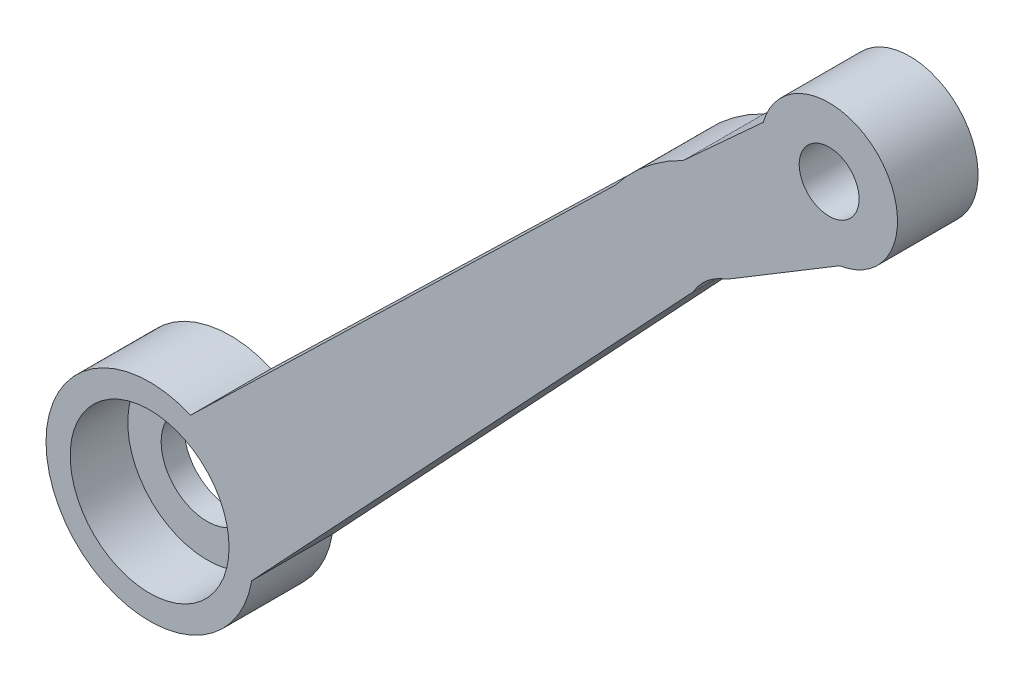
ISO-10303-21;
HEADER;
FILE_DESCRIPTION(('STEP AP214'),'2;1');
FILE_NAME('part.step','',(''),(''),'','','');
FILE_SCHEMA(('AUTOMOTIVE_DESIGN { 1 0 10303 214 1 1 1 1 }'));
ENDSEC;
DATA;
#1=APPLICATION_CONTEXT('core data for automotive mechanical design processes');
#2=APPLICATION_PROTOCOL_DEFINITION('international standard','automotive_design',2000,#1);
#3=PRODUCT_CONTEXT('',#1,'mechanical');
#4=PRODUCT('Part','Part','',(#3));
#5=PRODUCT_RELATED_PRODUCT_CATEGORY('part','',(#4));
#6=PRODUCT_DEFINITION_FORMATION('','',#4);
#7=PRODUCT_DEFINITION_CONTEXT('part definition',#1,'design');
#8=PRODUCT_DEFINITION('design','',#6,#7);
#9=PRODUCT_DEFINITION_SHAPE('','',#8);
#10=(LENGTH_UNIT() NAMED_UNIT(*) SI_UNIT(.MILLI.,.METRE.));
#11=(NAMED_UNIT(*) PLANE_ANGLE_UNIT() SI_UNIT($,.RADIAN.));
#12=(NAMED_UNIT(*) SI_UNIT($,.STERADIAN.) SOLID_ANGLE_UNIT());
#13=UNCERTAINTY_MEASURE_WITH_UNIT(LENGTH_MEASURE(1.E-05),#10,'distance_accuracy_value','');
#14=(GEOMETRIC_REPRESENTATION_CONTEXT(3) GLOBAL_UNCERTAINTY_ASSIGNED_CONTEXT((#13)) GLOBAL_UNIT_ASSIGNED_CONTEXT((#10,
#11,#12)) REPRESENTATION_CONTEXT('',''));
#15=CARTESIAN_POINT('',(0.,0.,0.));
#16=DIRECTION('',(0.,0.,1.));
#17=DIRECTION('',(1.,0.,0.));
#18=AXIS2_PLACEMENT_3D('',#15,#16,#17);
#19=CARTESIAN_POINT('',(-138.994793103417,-84.3283323026696,6.79269035065006));
#20=DIRECTION('',(0.,0.,1.));
#21=DIRECTION('',(1.,0.,0.));
#22=AXIS2_PLACEMENT_3D('',#19,#20,#21);
#23=PLANE('',#22);
#24=CARTESIAN_POINT('',(-50.4680392104002,-3.9750038774592,6.79269035065006));
#25=DIRECTION('',(0.,0.,1.));
#26=DIRECTION('',(1.,0.,0.));
#27=AXIS2_PLACEMENT_3D('',#24,#25,#26);
#28=CIRCLE('',#27,3.90000000000001);
#29=CARTESIAN_POINT('',(-46.5680392104001,-3.9750038774592,6.79269035065006));
#30=VERTEX_POINT('',#29);
#31=EDGE_CURVE('E165',#30,#30,#28,.T.);
#32=ORIENTED_EDGE('',*,*,#31,.F.);
#33=EDGE_LOOP('',(#32));
#34=FACE_BOUND('',#33,.T.);
#35=CARTESIAN_POINT('',(-138.994793103417,-84.3283323026696,6.79269035065006));
#36=DIRECTION('',(0.,0.,1.));
#37=DIRECTION('',(1.,0.,0.));
#38=AXIS2_PLACEMENT_3D('',#35,#36,#37);
#39=CIRCLE('',#38,13.5);
#40=CARTESIAN_POINT('',(-133.660112583292,-71.9270749572146,6.79269035065006));
#41=VERTEX_POINT('',#40);
#42=CARTESIAN_POINT('',(-125.688932711568,-86.609577408445,6.79269035065006));
#43=VERTEX_POINT('',#42);
#44=EDGE_CURVE('E112',#41,#43,#39,.T.);
#45=ORIENTED_EDGE('',*,*,#44,.T.);
#46=DIRECTION('',(0.683917048390765,0.729559778853291,0.));
#47=VECTOR('',#46,1.);
#48=CARTESIAN_POINT('',(-125.688932711568,-86.609577408445,6.79269035065006));
#49=LINE('',#48,#47);
#50=CARTESIAN_POINT('',(-68.1848369339732,-25.2678174722458,6.79269035065006));
#51=VERTEX_POINT('',#50);
#52=EDGE_CURVE('E174',#43,#51,#49,.T.);
#53=ORIENTED_EDGE('',*,*,#52,.T.);
#54=CARTESIAN_POINT('',(-61.1608541579813,-29.3018806798018,6.79269035065006));
#55=DIRECTION('',(0.,0.,-1.));
#56=DIRECTION('',(1.,0.,0.));
#57=AXIS2_PLACEMENT_3D('',#54,#55,#56);
#58=CIRCLE('',#57,8.09999999999925);
#59=CARTESIAN_POINT('',(-63.764516707869,-21.6317476088375,6.79269035065006));
#60=VERTEX_POINT('',#59);
#61=EDGE_CURVE('E177',#51,#60,#58,.T.);
#62=ORIENTED_EDGE('',*,*,#61,.T.);
#63=DIRECTION('',(0.856088074759195,0.51682996067865,0.));
#64=VECTOR('',#63,1.);
#65=CARTESIAN_POINT('',(-63.764516707869,-21.6317476088375,6.79269035065006));
#66=LINE('',#65,#64);
#67=CARTESIAN_POINT('',(-49.1016473183913,-12.7796091041263,6.79269035065006));
#68=VERTEX_POINT('',#67);
#69=EDGE_CURVE('E180',#60,#68,#66,.T.);
#70=ORIENTED_EDGE('',*,*,#69,.T.);
#71=CARTESIAN_POINT('',(-50.4680392104002,-3.9750038774592,6.79269035065006));
#72=DIRECTION('',(0.,0.,1.));
#73=DIRECTION('',(1.,0.,0.));
#74=AXIS2_PLACEMENT_3D('',#71,#72,#73);
#75=CIRCLE('',#74,8.91000000000005);
#76=CARTESIAN_POINT('',(-59.044990429255,-1.56170576297265,6.79269035065006));
#77=VERTEX_POINT('',#76);
#78=EDGE_CURVE('E183',#68,#77,#75,.T.);
#79=ORIENTED_EDGE('',*,*,#78,.T.);
#80=DIRECTION('',(-0.738432343533464,-0.674327571751057,0.));
#81=VECTOR('',#80,1.);
#82=CARTESIAN_POINT('',(-59.044990429255,-1.56170576297265,6.79269035065006));
#83=LINE('',#82,#81);
#84=CARTESIAN_POINT('',(-69.4681557092937,-11.0800154562017,6.79269035065006));
#85=VERTEX_POINT('',#84);
#86=EDGE_CURVE('E186',#77,#85,#83,.T.);
#87=ORIENTED_EDGE('',*,*,#86,.T.);
#88=CARTESIAN_POINT('',(-58.614319970954,-33.4328666807129,6.79269035065006));
#89=DIRECTION('',(0.,0.,1.));
#90=DIRECTION('',(1.,0.,0.));
#91=AXIS2_PLACEMENT_3D('',#88,#89,#90);
#92=CIRCLE('',#91,24.8486560622499);
#93=CARTESIAN_POINT('',(-78.3087961615021,-18.2808596955005,6.79269035065006));
#94=VERTEX_POINT('',#93);
#95=EDGE_CURVE('E63',#85,#94,#92,.T.);
#96=ORIENTED_EDGE('',*,*,#95,.T.);
#97=DIRECTION('',(-0.718080536459822,-0.695960015487653,0.));
#98=VECTOR('',#97,1.);
#99=CARTESIAN_POINT('',(-78.3087961615021,-18.2808596955005,6.79269035065006));
#100=LINE('',#99,#98);
#101=EDGE_CURVE('E58',#94,#41,#100,.T.);
#102=ORIENTED_EDGE('',*,*,#101,.T.);
#103=EDGE_LOOP('',(#45,#53,#62,#70,#79,#87,#96,#102));
#104=FACE_BOUND('',#103,.T.);
#105=CARTESIAN_POINT('',(-138.994793103417,-84.3283323026696,6.79269035065006));
#106=DIRECTION('',(0.,0.,1.));
#107=DIRECTION('',(1.,0.,0.));
#108=AXIS2_PLACEMENT_3D('',#105,#106,#107);
#109=CIRCLE('',#108,10.35);
#110=CARTESIAN_POINT('',(-128.644793103417,-84.3283323026696,6.79269035065006));
#111=VERTEX_POINT('',#110);
#112=EDGE_CURVE('E161',#111,#111,#109,.T.);
#113=ORIENTED_EDGE('',*,*,#112,.F.);
#114=EDGE_LOOP('',(#113));
#115=FACE_BOUND('',#114,.T.);
#116=ADVANCED_FACE('F42',(#34,#104,#115),#23,.T.);
#117=CARTESIAN_POINT('',(-138.994793103417,-84.3283323026696,6.79269035065006));
#118=DIRECTION('',(0.,0.,-1.));
#119=DIRECTION('',(-1.,0.,0.));
#120=AXIS2_PLACEMENT_3D('',#117,#118,#119);
#121=CYLINDRICAL_SURFACE('',#120,13.5);
#122=DIRECTION('',(0.,0.,-1.));
#123=VECTOR('',#122,1.);
#124=CARTESIAN_POINT('',(-133.660112583292,-71.9270749572146,6.79269035065006));
#125=LINE('',#124,#123);
#126=CARTESIAN_POINT('',(-133.660112583292,-71.9270749572146,-3.70730964934994));
#127=VERTEX_POINT('',#126);
#128=EDGE_CURVE('E107',#41,#127,#125,.T.);
#129=ORIENTED_EDGE('',*,*,#128,.T.);
#130=CARTESIAN_POINT('',(-138.994793103417,-84.3283323026696,-3.70730964934994));
#131=DIRECTION('',(0.,0.,-1.));
#132=DIRECTION('',(-1.,0.,0.));
#133=AXIS2_PLACEMENT_3D('',#130,#131,#132);
#134=CIRCLE('',#133,13.5);
#135=CARTESIAN_POINT('',(-125.688932711568,-86.609577408445,-3.70730964934994));
#136=VERTEX_POINT('',#135);
#137=EDGE_CURVE('E111',#136,#127,#134,.T.);
#138=ORIENTED_EDGE('',*,*,#137,.F.);
#139=DIRECTION('',(0.,0.,-1.));
#140=VECTOR('',#139,1.);
#141=CARTESIAN_POINT('',(-125.688932711568,-86.609577408445,6.79269035065006));
#142=LINE('',#141,#140);
#143=EDGE_CURVE('E11',#43,#136,#142,.T.);
#144=ORIENTED_EDGE('',*,*,#143,.F.);
#145=ORIENTED_EDGE('',*,*,#44,.F.);
#146=EDGE_LOOP('',(#129,#138,#144,#145));
#147=FACE_BOUND('',#146,.T.);
#148=ADVANCED_FACE('F44',(#147),#121,.T.);
#149=CARTESIAN_POINT('',(-125.688932711568,-86.609577408445,6.79269035065006));
#150=DIRECTION('',(-0.729559778853291,0.683917048390765,0.));
#151=DIRECTION('',(-0.683917048390765,-0.729559778853291,0.));
#152=AXIS2_PLACEMENT_3D('',#149,#150,#151);
#153=PLANE('',#152);
#154=ORIENTED_EDGE('',*,*,#143,.T.);
#155=DIRECTION('',(-0.683917048390765,-0.729559778853291,0.));
#156=VECTOR('',#155,1.);
#157=CARTESIAN_POINT('',(-68.1848369339732,-25.2678174722458,-3.70730964934994));
#158=LINE('',#157,#156);
#159=CARTESIAN_POINT('',(-68.1848369339732,-25.2678174722458,-3.70730964934994));
#160=VERTEX_POINT('',#159);
#161=EDGE_CURVE('E131',#160,#136,#158,.T.);
#162=ORIENTED_EDGE('',*,*,#161,.F.);
#163=DIRECTION('',(0.,0.,-1.));
#164=VECTOR('',#163,1.);
#165=CARTESIAN_POINT('',(-68.1848369339732,-25.2678174722458,6.79269035065006));
#166=LINE('',#165,#164);
#167=EDGE_CURVE('E51',#51,#160,#166,.T.);
#168=ORIENTED_EDGE('',*,*,#167,.F.);
#169=ORIENTED_EDGE('',*,*,#52,.F.);
#170=EDGE_LOOP('',(#154,#162,#168,#169));
#171=FACE_BOUND('',#170,.T.);
#172=ADVANCED_FACE('F215',(#171),#153,.F.);
#173=CARTESIAN_POINT('',(-61.1608541579813,-29.3018806798018,6.79269035065006));
#174=DIRECTION('',(0.,0.,-1.));
#175=DIRECTION('',(-1.,0.,0.));
#176=AXIS2_PLACEMENT_3D('',#173,#174,#175);
#177=CYLINDRICAL_SURFACE('',#176,8.09999999999925);
#178=ORIENTED_EDGE('',*,*,#167,.T.);
#179=CARTESIAN_POINT('',(-61.1608541579813,-29.3018806798018,-3.70730964934994));
#180=DIRECTION('',(0.,0.,1.));
#181=DIRECTION('',(-1.,0.,0.));
#182=AXIS2_PLACEMENT_3D('',#179,#180,#181);
#183=CIRCLE('',#182,8.09999999999925);
#184=CARTESIAN_POINT('',(-63.764516707869,-21.6317476088375,-3.70730964934994));
#185=VERTEX_POINT('',#184);
#186=EDGE_CURVE('E155',#185,#160,#183,.T.);
#187=ORIENTED_EDGE('',*,*,#186,.F.);
#188=DIRECTION('',(0.,0.,-1.));
#189=VECTOR('',#188,1.);
#190=CARTESIAN_POINT('',(-63.764516707869,-21.6317476088375,6.79269035065006));
#191=LINE('',#190,#189);
#192=EDGE_CURVE('E204',#60,#185,#191,.T.);
#193=ORIENTED_EDGE('',*,*,#192,.F.);
#194=ORIENTED_EDGE('',*,*,#61,.F.);
#195=EDGE_LOOP('',(#178,#187,#193,#194));
#196=FACE_BOUND('',#195,.T.);
#197=ADVANCED_FACE('F211',(#196),#177,.F.);
#198=CARTESIAN_POINT('',(-63.764516707869,-21.6317476088375,6.79269035065006));
#199=DIRECTION('',(-0.51682996067865,0.856088074759195,0.));
#200=DIRECTION('',(-0.856088074759195,-0.51682996067865,0.));
#201=AXIS2_PLACEMENT_3D('',#198,#199,#200);
#202=PLANE('',#201);
#203=ORIENTED_EDGE('',*,*,#192,.T.);
#204=DIRECTION('',(-0.856088074759194,-0.516829960678652,0.));
#205=VECTOR('',#204,1.);
#206=CARTESIAN_POINT('',(-49.1016473183913,-12.7796091041263,-3.70730964934994));
#207=LINE('',#206,#205);
#208=CARTESIAN_POINT('',(-49.1016473183913,-12.7796091041263,-3.70730964934994));
#209=VERTEX_POINT('',#208);
#210=EDGE_CURVE('E151',#209,#185,#207,.T.);
#211=ORIENTED_EDGE('',*,*,#210,.F.);
#212=DIRECTION('',(0.,0.,-1.));
#213=VECTOR('',#212,1.);
#214=CARTESIAN_POINT('',(-49.1016473183913,-12.7796091041263,6.79269035065006));
#215=LINE('',#214,#213);
#216=EDGE_CURVE('E201',#68,#209,#215,.T.);
#217=ORIENTED_EDGE('',*,*,#216,.F.);
#218=ORIENTED_EDGE('',*,*,#69,.F.);
#219=EDGE_LOOP('',(#203,#211,#217,#218));
#220=FACE_BOUND('',#219,.T.);
#221=ADVANCED_FACE('F258',(#220),#202,.F.);
#222=CARTESIAN_POINT('',(-50.4680392104002,-3.9750038774592,6.79269035065006));
#223=DIRECTION('',(0.,0.,-1.));
#224=DIRECTION('',(-1.,0.,0.));
#225=AXIS2_PLACEMENT_3D('',#222,#223,#224);
#226=CYLINDRICAL_SURFACE('',#225,8.91000000000005);
#227=ORIENTED_EDGE('',*,*,#216,.T.);
#228=CARTESIAN_POINT('',(-50.4680392104002,-3.9750038774592,-3.70730964934994));
#229=DIRECTION('',(0.,0.,-1.));
#230=DIRECTION('',(-1.,0.,0.));
#231=AXIS2_PLACEMENT_3D('',#228,#229,#230);
#232=CIRCLE('',#231,8.91000000000002);
#233=CARTESIAN_POINT('',(-59.044990429255,-1.56170576297265,-3.70730964934994));
#234=VERTEX_POINT('',#233);
#235=EDGE_CURVE('E147',#234,#209,#232,.T.);
#236=ORIENTED_EDGE('',*,*,#235,.F.);
#237=DIRECTION('',(0.,0.,-1.));
#238=VECTOR('',#237,1.);
#239=CARTESIAN_POINT('',(-59.044990429255,-1.56170576297265,6.79269035065006));
#240=LINE('',#239,#238);
#241=EDGE_CURVE('E198',#77,#234,#240,.T.);
#242=ORIENTED_EDGE('',*,*,#241,.F.);
#243=ORIENTED_EDGE('',*,*,#78,.F.);
#244=EDGE_LOOP('',(#227,#236,#242,#243));
#245=FACE_BOUND('',#244,.T.);
#246=ADVANCED_FACE('F254',(#245),#226,.T.);
#247=CARTESIAN_POINT('',(-59.044990429255,-1.56170576297265,6.79269035065006));
#248=DIRECTION('',(0.674327571751057,-0.738432343533464,0.));
#249=DIRECTION('',(0.738432343533464,0.674327571751057,0.));
#250=AXIS2_PLACEMENT_3D('',#247,#248,#249);
#251=PLANE('',#250);
#252=ORIENTED_EDGE('',*,*,#241,.T.);
#253=DIRECTION('',(0.738432343533464,0.674327571751057,0.));
#254=VECTOR('',#253,1.);
#255=CARTESIAN_POINT('',(-69.4681557092937,-11.0800154562017,-3.70730964934994));
#256=LINE('',#255,#254);
#257=CARTESIAN_POINT('',(-69.4681557092937,-11.0800154562017,-3.70730964934994));
#258=VERTEX_POINT('',#257);
#259=EDGE_CURVE('E143',#258,#234,#256,.T.);
#260=ORIENTED_EDGE('',*,*,#259,.F.);
#261=DIRECTION('',(0.,0.,-1.));
#262=VECTOR('',#261,1.);
#263=CARTESIAN_POINT('',(-69.4681557092937,-11.0800154562017,6.79269035065006));
#264=LINE('',#263,#262);
#265=EDGE_CURVE('E195',#85,#258,#264,.T.);
#266=ORIENTED_EDGE('',*,*,#265,.F.);
#267=ORIENTED_EDGE('',*,*,#86,.F.);
#268=EDGE_LOOP('',(#252,#260,#266,#267));
#269=FACE_BOUND('',#268,.T.);
#270=ADVANCED_FACE('F250',(#269),#251,.F.);
#271=CARTESIAN_POINT('',(-58.614319970954,-33.4328666807129,6.79269035065006));
#272=DIRECTION('',(0.,0.,-1.));
#273=DIRECTION('',(-1.,0.,0.));
#274=AXIS2_PLACEMENT_3D('',#271,#272,#273);
#275=CYLINDRICAL_SURFACE('',#274,24.8486560622499);
#276=ORIENTED_EDGE('',*,*,#265,.T.);
#277=CARTESIAN_POINT('',(-58.614319970954,-33.4328666807129,-3.70730964934994));
#278=DIRECTION('',(0.,0.,-1.));
#279=DIRECTION('',(-1.,0.,0.));
#280=AXIS2_PLACEMENT_3D('',#277,#278,#279);
#281=CIRCLE('',#280,24.8486560622499);
#282=CARTESIAN_POINT('',(-78.3087961615021,-18.2808596955005,-3.70730964934994));
#283=VERTEX_POINT('',#282);
#284=EDGE_CURVE('E124',#283,#258,#281,.T.);
#285=ORIENTED_EDGE('',*,*,#284,.F.);
#286=DIRECTION('',(0.,0.,-1.));
#287=VECTOR('',#286,1.);
#288=CARTESIAN_POINT('',(-78.3087961615021,-18.2808596955005,6.79269035065006));
#289=LINE('',#288,#287);
#290=EDGE_CURVE('E115',#94,#283,#289,.T.);
#291=ORIENTED_EDGE('',*,*,#290,.F.);
#292=ORIENTED_EDGE('',*,*,#95,.F.);
#293=EDGE_LOOP('',(#276,#285,#291,#292));
#294=FACE_BOUND('',#293,.T.);
#295=ADVANCED_FACE('F247',(#294),#275,.T.);
#296=CARTESIAN_POINT('',(-78.3087961615021,-18.2808596955005,6.79269035065006));
#297=DIRECTION('',(0.695960015487653,-0.718080536459822,0.));
#298=DIRECTION('',(0.718080536459822,0.695960015487653,0.));
#299=AXIS2_PLACEMENT_3D('',#296,#297,#298);
#300=PLANE('',#299);
#301=ORIENTED_EDGE('',*,*,#290,.T.);
#302=DIRECTION('',(0.718080536459822,0.695960015487653,0.));
#303=VECTOR('',#302,1.);
#304=CARTESIAN_POINT('',(-133.660112583292,-71.9270749572146,-3.70730964934994));
#305=LINE('',#304,#303);
#306=EDGE_CURVE('E118',#127,#283,#305,.T.);
#307=ORIENTED_EDGE('',*,*,#306,.F.);
#308=ORIENTED_EDGE('',*,*,#128,.F.);
#309=ORIENTED_EDGE('',*,*,#101,.F.);
#310=EDGE_LOOP('',(#301,#307,#308,#309));
#311=FACE_BOUND('',#310,.T.);
#312=ADVANCED_FACE('F119',(#311),#300,.F.);
#313=CARTESIAN_POINT('',(-50.4680392104002,-3.9750038774592,6.79269035065006));
#314=DIRECTION('',(0.,0.,-1.));
#315=DIRECTION('',(-1.,0.,0.));
#316=AXIS2_PLACEMENT_3D('',#313,#314,#315);
#317=CYLINDRICAL_SURFACE('',#316,3.90000000000001);
#318=ORIENTED_EDGE('',*,*,#31,.T.);
#319=EDGE_LOOP('',(#318));
#320=FACE_BOUND('',#319,.T.);
#321=CARTESIAN_POINT('',(-50.4680392104002,-3.9750038774592,-3.70730964934994));
#322=DIRECTION('',(0.,0.,-1.));
#323=DIRECTION('',(-1.,0.,0.));
#324=AXIS2_PLACEMENT_3D('',#321,#322,#323);
#325=CIRCLE('',#324,3.90000000000001);
#326=CARTESIAN_POINT('',(-54.3680392104002,-3.9750038774592,-3.70730964934994));
#327=VERTEX_POINT('',#326);
#328=EDGE_CURVE('E395',#327,#327,#325,.T.);
#329=ORIENTED_EDGE('',*,*,#328,.T.);
#330=EDGE_LOOP('',(#329));
#331=FACE_BOUND('',#330,.T.);
#332=ADVANCED_FACE('F226',(#320,#331),#317,.F.);
#333=CARTESIAN_POINT('',(-138.994793103417,-84.3283323026696,6.79269035065006));
#334=DIRECTION('',(0.,0.,-1.));
#335=DIRECTION('',(-1.,0.,0.));
#336=AXIS2_PLACEMENT_3D('',#333,#334,#335);
#337=CYLINDRICAL_SURFACE('',#336,10.35);
#338=ORIENTED_EDGE('',*,*,#112,.T.);
#339=EDGE_LOOP('',(#338));
#340=FACE_BOUND('',#339,.T.);
#341=CARTESIAN_POINT('',(-138.994793103417,-84.3283323026696,-0.707309649349936));
#342=DIRECTION('',(0.,0.,1.));
#343=DIRECTION('',(1.,0.,0.));
#344=AXIS2_PLACEMENT_3D('',#341,#342,#343);
#345=CIRCLE('',#344,10.35);
#346=CARTESIAN_POINT('',(-128.644793103417,-84.3283323026696,-0.707309649349936));
#347=VERTEX_POINT('',#346);
#348=EDGE_CURVE('E160',#347,#347,#345,.T.);
#349=ORIENTED_EDGE('',*,*,#348,.F.);
#350=EDGE_LOOP('',(#349));
#351=FACE_BOUND('',#350,.T.);
#352=ADVANCED_FACE('F222',(#340,#351),#337,.F.);
#353=CARTESIAN_POINT('',(-138.994793103417,-84.3283323026696,-0.707309649349936));
#354=DIRECTION('',(0.,0.,-1.));
#355=DIRECTION('',(-1.,0.,0.));
#356=AXIS2_PLACEMENT_3D('',#353,#354,#355);
#357=PLANE('',#356);
#358=CARTESIAN_POINT('',(-138.994793103417,-84.3283323026696,-0.707309649349936));
#359=DIRECTION('',(0.,0.,-1.));
#360=DIRECTION('',(-1.,0.,0.));
#361=AXIS2_PLACEMENT_3D('',#358,#359,#360);
#362=CIRCLE('',#361,5.99999999999997);
#363=CARTESIAN_POINT('',(-144.994793103417,-84.3283323026696,-0.707309649349936));
#364=VERTEX_POINT('',#363);
#365=EDGE_CURVE('E137',#364,#364,#362,.T.);
#366=ORIENTED_EDGE('',*,*,#365,.T.);
#367=EDGE_LOOP('',(#366));
#368=FACE_BOUND('',#367,.T.);
#369=ORIENTED_EDGE('',*,*,#348,.T.);
#370=EDGE_LOOP('',(#369));
#371=FACE_BOUND('',#370,.T.);
#372=ADVANCED_FACE('F225',(#368,#371),#357,.F.);
#373=CARTESIAN_POINT('',(-138.994793103417,-84.3283323026696,-3.70730964934994));
#374=DIRECTION('',(0.,0.,-1.));
#375=DIRECTION('',(-1.,0.,0.));
#376=AXIS2_PLACEMENT_3D('',#373,#374,#375);
#377=PLANE('',#376);
#378=CARTESIAN_POINT('',(-138.994793103417,-84.3283323026696,-3.70730964934994));
#379=DIRECTION('',(0.,0.,-1.));
#380=DIRECTION('',(-1.,0.,0.));
#381=AXIS2_PLACEMENT_3D('',#378,#379,#380);
#382=CIRCLE('',#381,5.99999999999997);
#383=CARTESIAN_POINT('',(-144.994793103417,-84.3283323026696,-3.70730964934994));
#384=VERTEX_POINT('',#383);
#385=EDGE_CURVE('E133',#384,#384,#382,.T.);
#386=ORIENTED_EDGE('',*,*,#385,.F.);
#387=EDGE_LOOP('',(#386));
#388=FACE_BOUND('',#387,.T.);
#389=ORIENTED_EDGE('',*,*,#137,.T.);
#390=ORIENTED_EDGE('',*,*,#306,.T.);
#391=ORIENTED_EDGE('',*,*,#284,.T.);
#392=ORIENTED_EDGE('',*,*,#259,.T.);
#393=ORIENTED_EDGE('',*,*,#235,.T.);
#394=ORIENTED_EDGE('',*,*,#210,.T.);
#395=ORIENTED_EDGE('',*,*,#186,.T.);
#396=ORIENTED_EDGE('',*,*,#161,.T.);
#397=EDGE_LOOP('',(#389,#390,#391,#392,#393,#394,#395,#396));
#398=FACE_BOUND('',#397,.T.);
#399=ORIENTED_EDGE('',*,*,#328,.F.);
#400=EDGE_LOOP('',(#399));
#401=FACE_BOUND('',#400,.T.);
#402=ADVANCED_FACE('F127',(#388,#398,#401),#377,.T.);
#403=CARTESIAN_POINT('',(-138.994793103417,-84.3283323026696,-3.70730964934994));
#404=DIRECTION('',(0.,0.,1.));
#405=DIRECTION('',(1.,0.,0.));
#406=AXIS2_PLACEMENT_3D('',#403,#404,#405);
#407=CYLINDRICAL_SURFACE('',#406,5.99999999999997);
#408=ORIENTED_EDGE('',*,*,#385,.T.);
#409=EDGE_LOOP('',(#408));
#410=FACE_BOUND('',#409,.T.);
#411=ORIENTED_EDGE('',*,*,#365,.F.);
#412=EDGE_LOOP('',(#411));
#413=FACE_BOUND('',#412,.T.);
#414=ADVANCED_FACE('F236',(#410,#413),#407,.F.);
#415=CLOSED_SHELL('',(#116,#148,#172,#197,#221,#246,#270,#295,#312,#332,#352,#372,#402,#414));
#416=MANIFOLD_SOLID_BREP('B2',#415);
#417=ADVANCED_BREP_SHAPE_REPRESENTATION('',(#18,#416),#14);
#418=SHAPE_DEFINITION_REPRESENTATION(#9,#417);
ENDSEC;
END-ISO-10303-21;
